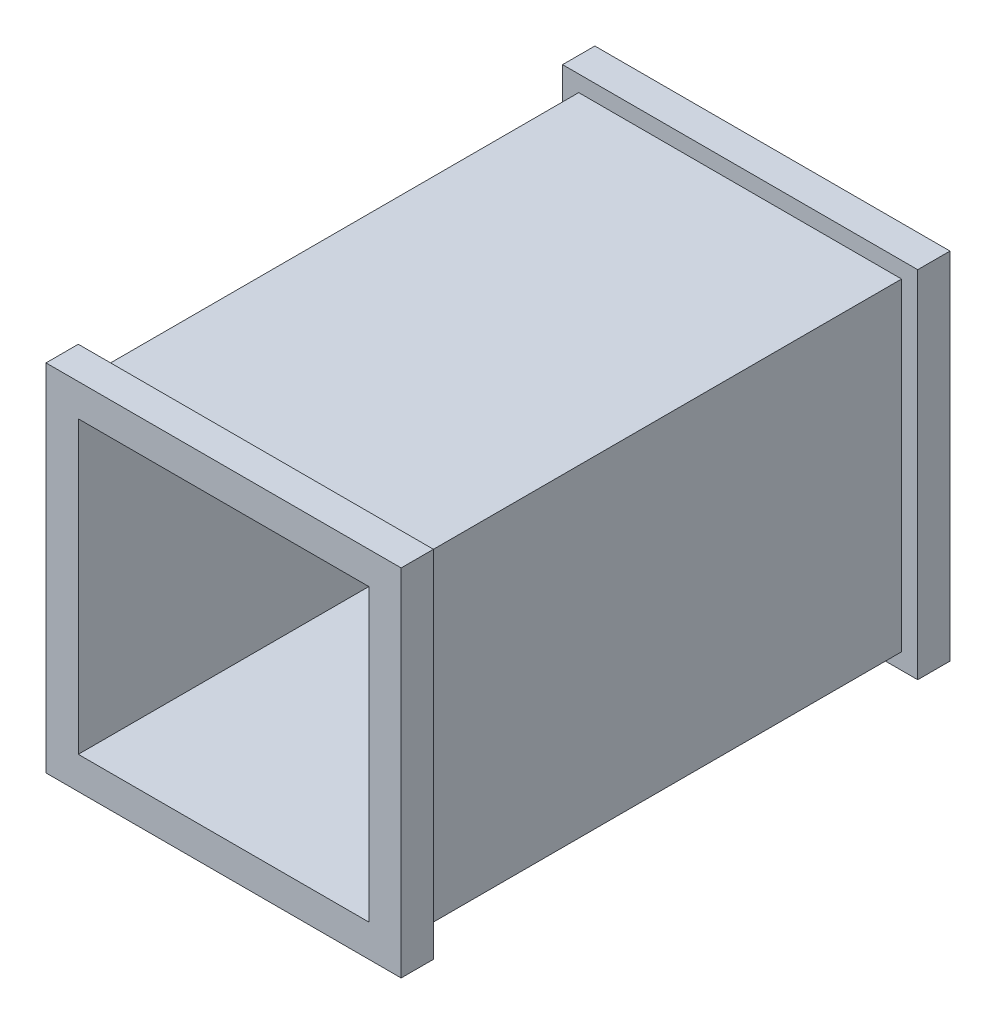
ISO-10303-21;
HEADER;
FILE_DESCRIPTION(('STEP AP214'),'2;1');
FILE_NAME('part.step','',(''),(''),'','','');
FILE_SCHEMA(('AUTOMOTIVE_DESIGN { 1 0 10303 214 1 1 1 1 }'));
ENDSEC;
DATA;
#1=APPLICATION_CONTEXT('core data for automotive mechanical design processes');
#2=APPLICATION_PROTOCOL_DEFINITION('international standard','automotive_design',2000,#1);
#3=PRODUCT_CONTEXT('',#1,'mechanical');
#4=PRODUCT('Part','Part','',(#3));
#5=PRODUCT_RELATED_PRODUCT_CATEGORY('part','',(#4));
#6=PRODUCT_DEFINITION_FORMATION('','',#4);
#7=PRODUCT_DEFINITION_CONTEXT('part definition',#1,'design');
#8=PRODUCT_DEFINITION('design','',#6,#7);
#9=PRODUCT_DEFINITION_SHAPE('','',#8);
#10=(LENGTH_UNIT() NAMED_UNIT(*) SI_UNIT(.MILLI.,.METRE.));
#11=(NAMED_UNIT(*) PLANE_ANGLE_UNIT() SI_UNIT($,.RADIAN.));
#12=(NAMED_UNIT(*) SI_UNIT($,.STERADIAN.) SOLID_ANGLE_UNIT());
#13=UNCERTAINTY_MEASURE_WITH_UNIT(LENGTH_MEASURE(1.E-05),#10,'distance_accuracy_value','');
#14=(GEOMETRIC_REPRESENTATION_CONTEXT(3) GLOBAL_UNCERTAINTY_ASSIGNED_CONTEXT((#13)) GLOBAL_UNIT_ASSIGNED_CONTEXT((#10,
#11,#12)) REPRESENTATION_CONTEXT('',''));
#15=CARTESIAN_POINT('',(0.,0.,0.));
#16=DIRECTION('',(0.,0.,1.));
#17=DIRECTION('',(1.,0.,0.));
#18=AXIS2_PLACEMENT_3D('',#15,#16,#17);
#19=CARTESIAN_POINT('',(127.,0.,0.));
#20=DIRECTION('',(1.,0.,0.));
#21=DIRECTION('',(0.,0.,-1.));
#22=AXIS2_PLACEMENT_3D('',#19,#20,#21);
#23=PLANE('',#22);
#24=DIRECTION('',(0.,0.,-1.));
#25=VECTOR('',#24,1.);
#26=CARTESIAN_POINT('',(127.,-127.,381.));
#27=LINE('',#26,#25);
#28=CARTESIAN_POINT('',(127.,-127.,381.));
#29=VERTEX_POINT('',#28);
#30=CARTESIAN_POINT('',(127.,-127.,0.));
#31=VERTEX_POINT('',#30);
#32=EDGE_CURVE('E328',#29,#31,#27,.T.);
#33=ORIENTED_EDGE('',*,*,#32,.T.);
#34=DIRECTION('',(0.,1.,0.));
#35=VECTOR('',#34,1.);
#36=CARTESIAN_POINT('',(127.,-127.,0.));
#37=LINE('',#36,#35);
#38=CARTESIAN_POINT('',(127.,127.,0.));
#39=VERTEX_POINT('',#38);
#40=EDGE_CURVE('E337',#31,#39,#37,.T.);
#41=ORIENTED_EDGE('',*,*,#40,.T.);
#42=DIRECTION('',(0.,0.,-1.));
#43=VECTOR('',#42,1.);
#44=CARTESIAN_POINT('',(127.,127.,381.));
#45=LINE('',#44,#43);
#46=CARTESIAN_POINT('',(127.,127.,381.));
#47=VERTEX_POINT('',#46);
#48=EDGE_CURVE('E325',#47,#39,#45,.T.);
#49=ORIENTED_EDGE('',*,*,#48,.F.);
#50=DIRECTION('',(0.,1.,0.));
#51=VECTOR('',#50,1.);
#52=CARTESIAN_POINT('',(127.,-127.,381.));
#53=LINE('',#52,#51);
#54=EDGE_CURVE('E185',#29,#47,#53,.T.);
#55=ORIENTED_EDGE('',*,*,#54,.F.);
#56=EDGE_LOOP('',(#33,#41,#49,#55));
#57=FACE_BOUND('',#56,.T.);
#58=ADVANCED_FACE('F57',(#57),#23,.T.);
#59=CARTESIAN_POINT('',(0.,127.,0.));
#60=DIRECTION('',(0.,1.,0.));
#61=DIRECTION('',(0.,0.,1.));
#62=AXIS2_PLACEMENT_3D('',#59,#60,#61);
#63=PLANE('',#62);
#64=ORIENTED_EDGE('',*,*,#48,.T.);
#65=DIRECTION('',(-1.,0.,0.));
#66=VECTOR('',#65,1.);
#67=CARTESIAN_POINT('',(-127.,127.,0.));
#68=LINE('',#67,#66);
#69=CARTESIAN_POINT('',(-127.,127.,0.));
#70=VERTEX_POINT('',#69);
#71=EDGE_CURVE('E345',#39,#70,#68,.T.);
#72=ORIENTED_EDGE('',*,*,#71,.T.);
#73=DIRECTION('',(0.,0.,-1.));
#74=VECTOR('',#73,1.);
#75=CARTESIAN_POINT('',(-127.,127.,381.));
#76=LINE('',#75,#74);
#77=CARTESIAN_POINT('',(-127.,127.,381.));
#78=VERTEX_POINT('',#77);
#79=EDGE_CURVE('E324',#78,#70,#76,.T.);
#80=ORIENTED_EDGE('',*,*,#79,.F.);
#81=DIRECTION('',(-1.,0.,0.));
#82=VECTOR('',#81,1.);
#83=CARTESIAN_POINT('',(-127.,127.,381.));
#84=LINE('',#83,#82);
#85=EDGE_CURVE('E368',#47,#78,#84,.T.);
#86=ORIENTED_EDGE('',*,*,#85,.F.);
#87=EDGE_LOOP('',(#64,#72,#80,#86));
#88=FACE_BOUND('',#87,.T.);
#89=ADVANCED_FACE('F384',(#88),#63,.T.);
#90=CARTESIAN_POINT('',(0.,-127.,0.));
#91=DIRECTION('',(0.,-1.,0.));
#92=DIRECTION('',(0.,0.,-1.));
#93=AXIS2_PLACEMENT_3D('',#90,#91,#92);
#94=PLANE('',#93);
#95=DIRECTION('',(0.,0.,-1.));
#96=VECTOR('',#95,1.);
#97=CARTESIAN_POINT('',(-127.,-127.,381.));
#98=LINE('',#97,#96);
#99=CARTESIAN_POINT('',(-127.,-127.,381.));
#100=VERTEX_POINT('',#99);
#101=CARTESIAN_POINT('',(-127.,-127.,0.));
#102=VERTEX_POINT('',#101);
#103=EDGE_CURVE('E320',#100,#102,#98,.T.);
#104=ORIENTED_EDGE('',*,*,#103,.T.);
#105=DIRECTION('',(1.,0.,0.));
#106=VECTOR('',#105,1.);
#107=CARTESIAN_POINT('',(-127.,-127.,0.));
#108=LINE('',#107,#106);
#109=EDGE_CURVE('E12',#102,#31,#108,.T.);
#110=ORIENTED_EDGE('',*,*,#109,.T.);
#111=ORIENTED_EDGE('',*,*,#32,.F.);
#112=DIRECTION('',(1.,0.,0.));
#113=VECTOR('',#112,1.);
#114=CARTESIAN_POINT('',(-127.,-127.,381.));
#115=LINE('',#114,#113);
#116=EDGE_CURVE('E332',#100,#29,#115,.T.);
#117=ORIENTED_EDGE('',*,*,#116,.F.);
#118=EDGE_LOOP('',(#104,#110,#111,#117));
#119=FACE_BOUND('',#118,.T.);
#120=ADVANCED_FACE('F386',(#119),#94,.T.);
#121=CARTESIAN_POINT('',(-127.,0.,0.));
#122=DIRECTION('',(-1.,0.,0.));
#123=DIRECTION('',(0.,0.,1.));
#124=AXIS2_PLACEMENT_3D('',#121,#122,#123);
#125=PLANE('',#124);
#126=ORIENTED_EDGE('',*,*,#79,.T.);
#127=DIRECTION('',(0.,-1.,0.));
#128=VECTOR('',#127,1.);
#129=CARTESIAN_POINT('',(-127.,-127.,0.));
#130=LINE('',#129,#128);
#131=EDGE_CURVE('E67',#70,#102,#130,.T.);
#132=ORIENTED_EDGE('',*,*,#131,.T.);
#133=ORIENTED_EDGE('',*,*,#103,.F.);
#134=DIRECTION('',(0.,-1.,0.));
#135=VECTOR('',#134,1.);
#136=CARTESIAN_POINT('',(-127.,-127.,381.));
#137=LINE('',#136,#135);
#138=EDGE_CURVE('E82',#78,#100,#137,.T.);
#139=ORIENTED_EDGE('',*,*,#138,.F.);
#140=EDGE_LOOP('',(#126,#132,#133,#139));
#141=FACE_BOUND('',#140,.T.);
#142=ADVANCED_FACE('F59',(#141),#125,.T.);
#143=CARTESIAN_POINT('',(-114.3,0.,0.));
#144=DIRECTION('',(1.,0.,0.));
#145=DIRECTION('',(0.,0.,-1.));
#146=AXIS2_PLACEMENT_3D('',#143,#144,#145);
#147=PLANE('',#146);
#148=DIRECTION('',(0.,0.,1.));
#149=VECTOR('',#148,1.);
#150=CARTESIAN_POINT('',(-114.3,-114.3,0.));
#151=LINE('',#150,#149);
#152=CARTESIAN_POINT('',(-114.3,-114.3,-25.4));
#153=VERTEX_POINT('',#152);
#154=CARTESIAN_POINT('',(-114.3,-114.3,406.4));
#155=VERTEX_POINT('',#154);
#156=EDGE_CURVE('E304',#153,#155,#151,.T.);
#157=ORIENTED_EDGE('',*,*,#156,.F.);
#158=DIRECTION('',(0.,1.,0.));
#159=VECTOR('',#158,1.);
#160=CARTESIAN_POINT('',(-114.3,-114.3,-25.4));
#161=LINE('',#160,#159);
#162=CARTESIAN_POINT('',(-114.3,114.3,-25.4));
#163=VERTEX_POINT('',#162);
#164=EDGE_CURVE('E249',#153,#163,#161,.T.);
#165=ORIENTED_EDGE('',*,*,#164,.T.);
#166=DIRECTION('',(0.,0.,1.));
#167=VECTOR('',#166,1.);
#168=CARTESIAN_POINT('',(-114.3,114.3,0.));
#169=LINE('',#168,#167);
#170=CARTESIAN_POINT('',(-114.3,114.3,406.4));
#171=VERTEX_POINT('',#170);
#172=EDGE_CURVE('E307',#163,#171,#169,.T.);
#173=ORIENTED_EDGE('',*,*,#172,.T.);
#174=DIRECTION('',(0.,-1.,0.));
#175=VECTOR('',#174,1.);
#176=CARTESIAN_POINT('',(-114.3,-114.3,406.4));
#177=LINE('',#176,#175);
#178=EDGE_CURVE('E198',#171,#155,#177,.T.);
#179=ORIENTED_EDGE('',*,*,#178,.T.);
#180=EDGE_LOOP('',(#157,#165,#173,#179));
#181=FACE_BOUND('',#180,.T.);
#182=ADVANCED_FACE('F414',(#181),#147,.T.);
#183=CARTESIAN_POINT('',(0.,114.3,0.));
#184=DIRECTION('',(0.,-1.,0.));
#185=DIRECTION('',(0.,0.,-1.));
#186=AXIS2_PLACEMENT_3D('',#183,#184,#185);
#187=PLANE('',#186);
#188=ORIENTED_EDGE('',*,*,#172,.F.);
#189=DIRECTION('',(1.,0.,0.));
#190=VECTOR('',#189,1.);
#191=CARTESIAN_POINT('',(114.3,114.3,-25.4));
#192=LINE('',#191,#190);
#193=CARTESIAN_POINT('',(114.3,114.3,-25.4));
#194=VERTEX_POINT('',#193);
#195=EDGE_CURVE('E180',#163,#194,#192,.T.);
#196=ORIENTED_EDGE('',*,*,#195,.T.);
#197=DIRECTION('',(0.,0.,1.));
#198=VECTOR('',#197,1.);
#199=CARTESIAN_POINT('',(114.3,114.3,0.));
#200=LINE('',#199,#198);
#201=CARTESIAN_POINT('',(114.3,114.3,406.4));
#202=VERTEX_POINT('',#201);
#203=EDGE_CURVE('E173',#194,#202,#200,.T.);
#204=ORIENTED_EDGE('',*,*,#203,.T.);
#205=DIRECTION('',(-1.,0.,0.));
#206=VECTOR('',#205,1.);
#207=CARTESIAN_POINT('',(-114.3,114.3,406.4));
#208=LINE('',#207,#206);
#209=EDGE_CURVE('E177',#202,#171,#208,.T.);
#210=ORIENTED_EDGE('',*,*,#209,.T.);
#211=EDGE_LOOP('',(#188,#196,#204,#210));
#212=FACE_BOUND('',#211,.T.);
#213=ADVANCED_FACE('F175',(#212),#187,.T.);
#214=CARTESIAN_POINT('',(0.,-114.3,0.));
#215=DIRECTION('',(0.,1.,0.));
#216=DIRECTION('',(0.,0.,1.));
#217=AXIS2_PLACEMENT_3D('',#214,#215,#216);
#218=PLANE('',#217);
#219=DIRECTION('',(0.,0.,1.));
#220=VECTOR('',#219,1.);
#221=CARTESIAN_POINT('',(114.3,-114.3,0.));
#222=LINE('',#221,#220);
#223=CARTESIAN_POINT('',(114.3,-114.3,-25.4));
#224=VERTEX_POINT('',#223);
#225=CARTESIAN_POINT('',(114.3,-114.3,406.4));
#226=VERTEX_POINT('',#225);
#227=EDGE_CURVE('E186',#224,#226,#222,.T.);
#228=ORIENTED_EDGE('',*,*,#227,.F.);
#229=DIRECTION('',(-1.,0.,0.));
#230=VECTOR('',#229,1.);
#231=CARTESIAN_POINT('',(114.3,-114.3,-25.4));
#232=LINE('',#231,#230);
#233=EDGE_CURVE('E258',#224,#153,#232,.T.);
#234=ORIENTED_EDGE('',*,*,#233,.T.);
#235=ORIENTED_EDGE('',*,*,#156,.T.);
#236=DIRECTION('',(1.,0.,0.));
#237=VECTOR('',#236,1.);
#238=CARTESIAN_POINT('',(-114.3,-114.3,406.4));
#239=LINE('',#238,#237);
#240=EDGE_CURVE('E202',#155,#226,#239,.T.);
#241=ORIENTED_EDGE('',*,*,#240,.T.);
#242=EDGE_LOOP('',(#228,#234,#235,#241));
#243=FACE_BOUND('',#242,.T.);
#244=ADVANCED_FACE('F399',(#243),#218,.T.);
#245=CARTESIAN_POINT('',(114.3,0.,0.));
#246=DIRECTION('',(-1.,0.,0.));
#247=DIRECTION('',(0.,0.,1.));
#248=AXIS2_PLACEMENT_3D('',#245,#246,#247);
#249=PLANE('',#248);
#250=ORIENTED_EDGE('',*,*,#203,.F.);
#251=DIRECTION('',(0.,-1.,0.));
#252=VECTOR('',#251,1.);
#253=CARTESIAN_POINT('',(114.3,-114.3,-25.4));
#254=LINE('',#253,#252);
#255=EDGE_CURVE('E255',#194,#224,#254,.T.);
#256=ORIENTED_EDGE('',*,*,#255,.T.);
#257=ORIENTED_EDGE('',*,*,#227,.T.);
#258=DIRECTION('',(0.,1.,0.));
#259=VECTOR('',#258,1.);
#260=CARTESIAN_POINT('',(114.3,-114.3,406.4));
#261=LINE('',#260,#259);
#262=EDGE_CURVE('E189',#226,#202,#261,.T.);
#263=ORIENTED_EDGE('',*,*,#262,.T.);
#264=EDGE_LOOP('',(#250,#256,#257,#263));
#265=FACE_BOUND('',#264,.T.);
#266=ADVANCED_FACE('F190',(#265),#249,.T.);
#267=CARTESIAN_POINT('',(0.,0.,0.));
#268=DIRECTION('',(0.,0.,-1.));
#269=DIRECTION('',(-1.,0.,0.));
#270=AXIS2_PLACEMENT_3D('',#267,#268,#269);
#271=PLANE('',#270);
#272=DIRECTION('',(-1.,0.,0.));
#273=VECTOR('',#272,1.);
#274=CARTESIAN_POINT('',(139.7,-139.7,0.));
#275=LINE('',#274,#273);
#276=CARTESIAN_POINT('',(139.7,-139.7,0.));
#277=VERTEX_POINT('',#276);
#278=CARTESIAN_POINT('',(-139.7,-139.7,0.));
#279=VERTEX_POINT('',#278);
#280=EDGE_CURVE('E262',#277,#279,#275,.T.);
#281=ORIENTED_EDGE('',*,*,#280,.F.);
#282=DIRECTION('',(0.,-1.,0.));
#283=VECTOR('',#282,1.);
#284=CARTESIAN_POINT('',(139.7,139.7,0.));
#285=LINE('',#284,#283);
#286=CARTESIAN_POINT('',(139.7,139.7,0.));
#287=VERTEX_POINT('',#286);
#288=EDGE_CURVE('E268',#287,#277,#285,.T.);
#289=ORIENTED_EDGE('',*,*,#288,.F.);
#290=DIRECTION('',(1.,0.,0.));
#291=VECTOR('',#290,1.);
#292=CARTESIAN_POINT('',(-139.7,139.7,0.));
#293=LINE('',#292,#291);
#294=CARTESIAN_POINT('',(-139.7,139.7,0.));
#295=VERTEX_POINT('',#294);
#296=EDGE_CURVE('E284',#295,#287,#293,.T.);
#297=ORIENTED_EDGE('',*,*,#296,.F.);
#298=DIRECTION('',(0.,1.,0.));
#299=VECTOR('',#298,1.);
#300=CARTESIAN_POINT('',(-139.7,-139.7,0.));
#301=LINE('',#300,#299);
#302=EDGE_CURVE('E281',#279,#295,#301,.T.);
#303=ORIENTED_EDGE('',*,*,#302,.F.);
#304=EDGE_LOOP('',(#281,#289,#297,#303));
#305=FACE_BOUND('',#304,.T.);
#306=ORIENTED_EDGE('',*,*,#71,.F.);
#307=ORIENTED_EDGE('',*,*,#40,.F.);
#308=ORIENTED_EDGE('',*,*,#109,.F.);
#309=ORIENTED_EDGE('',*,*,#131,.F.);
#310=EDGE_LOOP('',(#306,#307,#308,#309));
#311=FACE_BOUND('',#310,.T.);
#312=ADVANCED_FACE('F387',(#305,#311),#271,.F.);
#313=CARTESIAN_POINT('',(0.,0.,-25.4));
#314=DIRECTION('',(0.,0.,-1.));
#315=DIRECTION('',(-1.,0.,0.));
#316=AXIS2_PLACEMENT_3D('',#313,#314,#315);
#317=PLANE('',#316);
#318=DIRECTION('',(-1.,0.,0.));
#319=VECTOR('',#318,1.);
#320=CARTESIAN_POINT('',(139.7,-139.7,-25.4));
#321=LINE('',#320,#319);
#322=CARTESIAN_POINT('',(139.7,-139.7,-25.4));
#323=VERTEX_POINT('',#322);
#324=CARTESIAN_POINT('',(-139.7,-139.7,-25.4));
#325=VERTEX_POINT('',#324);
#326=EDGE_CURVE('E263',#323,#325,#321,.T.);
#327=ORIENTED_EDGE('',*,*,#326,.T.);
#328=DIRECTION('',(0.,1.,0.));
#329=VECTOR('',#328,1.);
#330=CARTESIAN_POINT('',(-139.7,-139.7,-25.4));
#331=LINE('',#330,#329);
#332=CARTESIAN_POINT('',(-139.7,139.7,-25.4));
#333=VERTEX_POINT('',#332);
#334=EDGE_CURVE('E267',#325,#333,#331,.T.);
#335=ORIENTED_EDGE('',*,*,#334,.T.);
#336=DIRECTION('',(1.,0.,0.));
#337=VECTOR('',#336,1.);
#338=CARTESIAN_POINT('',(-139.7,139.7,-25.4));
#339=LINE('',#338,#337);
#340=CARTESIAN_POINT('',(139.7,139.7,-25.4));
#341=VERTEX_POINT('',#340);
#342=EDGE_CURVE('E271',#333,#341,#339,.T.);
#343=ORIENTED_EDGE('',*,*,#342,.T.);
#344=DIRECTION('',(0.,-1.,0.));
#345=VECTOR('',#344,1.);
#346=CARTESIAN_POINT('',(139.7,139.7,-25.4));
#347=LINE('',#346,#345);
#348=EDGE_CURVE('E274',#341,#323,#347,.T.);
#349=ORIENTED_EDGE('',*,*,#348,.T.);
#350=EDGE_LOOP('',(#327,#335,#343,#349));
#351=FACE_BOUND('',#350,.T.);
#352=ORIENTED_EDGE('',*,*,#195,.F.);
#353=ORIENTED_EDGE('',*,*,#164,.F.);
#354=ORIENTED_EDGE('',*,*,#233,.F.);
#355=ORIENTED_EDGE('',*,*,#255,.F.);
#356=EDGE_LOOP('',(#352,#353,#354,#355));
#357=FACE_BOUND('',#356,.T.);
#358=ADVANCED_FACE('F389',(#351,#357),#317,.T.);
#359=CARTESIAN_POINT('',(139.7,-139.7,-25.4));
#360=DIRECTION('',(0.,1.,0.));
#361=DIRECTION('',(0.,0.,1.));
#362=AXIS2_PLACEMENT_3D('',#359,#360,#361);
#363=PLANE('',#362);
#364=ORIENTED_EDGE('',*,*,#280,.T.);
#365=DIRECTION('',(0.,0.,1.));
#366=VECTOR('',#365,1.);
#367=CARTESIAN_POINT('',(-139.7,-139.7,-25.4));
#368=LINE('',#367,#366);
#369=EDGE_CURVE('E300',#325,#279,#368,.T.);
#370=ORIENTED_EDGE('',*,*,#369,.F.);
#371=ORIENTED_EDGE('',*,*,#326,.F.);
#372=DIRECTION('',(0.,0.,1.));
#373=VECTOR('',#372,1.);
#374=CARTESIAN_POINT('',(139.7,-139.7,-25.4));
#375=LINE('',#374,#373);
#376=EDGE_CURVE('E277',#323,#277,#375,.T.);
#377=ORIENTED_EDGE('',*,*,#376,.T.);
#378=EDGE_LOOP('',(#364,#370,#371,#377));
#379=FACE_BOUND('',#378,.T.);
#380=ADVANCED_FACE('F396',(#379),#363,.F.);
#381=CARTESIAN_POINT('',(-139.7,-139.7,-25.4));
#382=DIRECTION('',(1.,0.,0.));
#383=DIRECTION('',(0.,0.,-1.));
#384=AXIS2_PLACEMENT_3D('',#381,#382,#383);
#385=PLANE('',#384);
#386=ORIENTED_EDGE('',*,*,#302,.T.);
#387=DIRECTION('',(0.,0.,1.));
#388=VECTOR('',#387,1.);
#389=CARTESIAN_POINT('',(-139.7,139.7,-25.4));
#390=LINE('',#389,#388);
#391=EDGE_CURVE('E296',#333,#295,#390,.T.);
#392=ORIENTED_EDGE('',*,*,#391,.F.);
#393=ORIENTED_EDGE('',*,*,#334,.F.);
#394=ORIENTED_EDGE('',*,*,#369,.T.);
#395=EDGE_LOOP('',(#386,#392,#393,#394));
#396=FACE_BOUND('',#395,.T.);
#397=ADVANCED_FACE('F524',(#396),#385,.F.);
#398=CARTESIAN_POINT('',(-139.7,139.7,-25.4));
#399=DIRECTION('',(0.,-1.,0.));
#400=DIRECTION('',(0.,0.,-1.));
#401=AXIS2_PLACEMENT_3D('',#398,#399,#400);
#402=PLANE('',#401);
#403=ORIENTED_EDGE('',*,*,#296,.T.);
#404=DIRECTION('',(0.,0.,1.));
#405=VECTOR('',#404,1.);
#406=CARTESIAN_POINT('',(139.7,139.7,-25.4));
#407=LINE('',#406,#405);
#408=EDGE_CURVE('E292',#341,#287,#407,.T.);
#409=ORIENTED_EDGE('',*,*,#408,.F.);
#410=ORIENTED_EDGE('',*,*,#342,.F.);
#411=ORIENTED_EDGE('',*,*,#391,.T.);
#412=EDGE_LOOP('',(#403,#409,#410,#411));
#413=FACE_BOUND('',#412,.T.);
#414=ADVANCED_FACE('F517',(#413),#402,.F.);
#415=CARTESIAN_POINT('',(139.7,139.7,-25.4));
#416=DIRECTION('',(-1.,0.,0.));
#417=DIRECTION('',(0.,0.,1.));
#418=AXIS2_PLACEMENT_3D('',#415,#416,#417);
#419=PLANE('',#418);
#420=ORIENTED_EDGE('',*,*,#288,.T.);
#421=ORIENTED_EDGE('',*,*,#376,.F.);
#422=ORIENTED_EDGE('',*,*,#348,.F.);
#423=ORIENTED_EDGE('',*,*,#408,.T.);
#424=EDGE_LOOP('',(#420,#421,#422,#423));
#425=FACE_BOUND('',#424,.T.);
#426=ADVANCED_FACE('F449',(#425),#419,.F.);
#427=CARTESIAN_POINT('',(0.,0.,381.));
#428=DIRECTION('',(0.,0.,1.));
#429=DIRECTION('',(1.,0.,0.));
#430=AXIS2_PLACEMENT_3D('',#427,#428,#429);
#431=PLANE('',#430);
#432=DIRECTION('',(1.,0.,0.));
#433=VECTOR('',#432,1.);
#434=CARTESIAN_POINT('',(-139.7,-139.7,381.));
#435=LINE('',#434,#433);
#436=CARTESIAN_POINT('',(-139.7,-139.7,381.));
#437=VERTEX_POINT('',#436);
#438=CARTESIAN_POINT('',(139.7,-139.7,381.));
#439=VERTEX_POINT('',#438);
#440=EDGE_CURVE('E207',#437,#439,#435,.T.);
#441=ORIENTED_EDGE('',*,*,#440,.F.);
#442=DIRECTION('',(0.,-1.,0.));
#443=VECTOR('',#442,1.);
#444=CARTESIAN_POINT('',(-139.7,139.7,381.));
#445=LINE('',#444,#443);
#446=CARTESIAN_POINT('',(-139.7,139.7,381.));
#447=VERTEX_POINT('',#446);
#448=EDGE_CURVE('E213',#447,#437,#445,.T.);
#449=ORIENTED_EDGE('',*,*,#448,.F.);
#450=DIRECTION('',(-1.,0.,0.));
#451=VECTOR('',#450,1.);
#452=CARTESIAN_POINT('',(139.7,139.7,381.));
#453=LINE('',#452,#451);
#454=CARTESIAN_POINT('',(139.7,139.7,381.));
#455=VERTEX_POINT('',#454);
#456=EDGE_CURVE('E229',#455,#447,#453,.T.);
#457=ORIENTED_EDGE('',*,*,#456,.F.);
#458=DIRECTION('',(0.,1.,0.));
#459=VECTOR('',#458,1.);
#460=CARTESIAN_POINT('',(139.7,-139.7,381.));
#461=LINE('',#460,#459);
#462=EDGE_CURVE('E226',#439,#455,#461,.T.);
#463=ORIENTED_EDGE('',*,*,#462,.F.);
#464=EDGE_LOOP('',(#441,#449,#457,#463));
#465=FACE_BOUND('',#464,.T.);
#466=ORIENTED_EDGE('',*,*,#116,.T.);
#467=ORIENTED_EDGE('',*,*,#54,.T.);
#468=ORIENTED_EDGE('',*,*,#85,.T.);
#469=ORIENTED_EDGE('',*,*,#138,.T.);
#470=EDGE_LOOP('',(#466,#467,#468,#469));
#471=FACE_BOUND('',#470,.T.);
#472=ADVANCED_FACE('F379',(#465,#471),#431,.F.);
#473=CARTESIAN_POINT('',(0.,0.,406.4));
#474=DIRECTION('',(0.,0.,1.));
#475=DIRECTION('',(1.,0.,0.));
#476=AXIS2_PLACEMENT_3D('',#473,#474,#475);
#477=PLANE('',#476);
#478=DIRECTION('',(1.,0.,0.));
#479=VECTOR('',#478,1.);
#480=CARTESIAN_POINT('',(-139.7,-139.7,406.4));
#481=LINE('',#480,#479);
#482=CARTESIAN_POINT('',(-139.7,-139.7,406.4));
#483=VERTEX_POINT('',#482);
#484=CARTESIAN_POINT('',(139.7,-139.7,406.4));
#485=VERTEX_POINT('',#484);
#486=EDGE_CURVE('E208',#483,#485,#481,.T.);
#487=ORIENTED_EDGE('',*,*,#486,.T.);
#488=DIRECTION('',(0.,1.,0.));
#489=VECTOR('',#488,1.);
#490=CARTESIAN_POINT('',(139.7,-139.7,406.4));
#491=LINE('',#490,#489);
#492=CARTESIAN_POINT('',(139.7,139.7,406.4));
#493=VERTEX_POINT('',#492);
#494=EDGE_CURVE('E212',#485,#493,#491,.T.);
#495=ORIENTED_EDGE('',*,*,#494,.T.);
#496=DIRECTION('',(-1.,0.,0.));
#497=VECTOR('',#496,1.);
#498=CARTESIAN_POINT('',(139.7,139.7,406.4));
#499=LINE('',#498,#497);
#500=CARTESIAN_POINT('',(-139.7,139.7,406.4));
#501=VERTEX_POINT('',#500);
#502=EDGE_CURVE('E216',#493,#501,#499,.T.);
#503=ORIENTED_EDGE('',*,*,#502,.T.);
#504=DIRECTION('',(0.,-1.,0.));
#505=VECTOR('',#504,1.);
#506=CARTESIAN_POINT('',(-139.7,139.7,406.4));
#507=LINE('',#506,#505);
#508=EDGE_CURVE('E219',#501,#483,#507,.T.);
#509=ORIENTED_EDGE('',*,*,#508,.T.);
#510=EDGE_LOOP('',(#487,#495,#503,#509));
#511=FACE_BOUND('',#510,.T.);
#512=ORIENTED_EDGE('',*,*,#209,.F.);
#513=ORIENTED_EDGE('',*,*,#262,.F.);
#514=ORIENTED_EDGE('',*,*,#240,.F.);
#515=ORIENTED_EDGE('',*,*,#178,.F.);
#516=EDGE_LOOP('',(#512,#513,#514,#515));
#517=FACE_BOUND('',#516,.T.);
#518=ADVANCED_FACE('F196',(#511,#517),#477,.T.);
#519=CARTESIAN_POINT('',(-139.7,-139.7,406.4));
#520=DIRECTION('',(0.,1.,0.));
#521=DIRECTION('',(0.,0.,1.));
#522=AXIS2_PLACEMENT_3D('',#519,#520,#521);
#523=PLANE('',#522);
#524=ORIENTED_EDGE('',*,*,#440,.T.);
#525=DIRECTION('',(0.,0.,-1.));
#526=VECTOR('',#525,1.);
#527=CARTESIAN_POINT('',(139.7,-139.7,406.4));
#528=LINE('',#527,#526);
#529=EDGE_CURVE('E245',#485,#439,#528,.T.);
#530=ORIENTED_EDGE('',*,*,#529,.F.);
#531=ORIENTED_EDGE('',*,*,#486,.F.);
#532=DIRECTION('',(0.,0.,-1.));
#533=VECTOR('',#532,1.);
#534=CARTESIAN_POINT('',(-139.7,-139.7,406.4));
#535=LINE('',#534,#533);
#536=EDGE_CURVE('E222',#483,#437,#535,.T.);
#537=ORIENTED_EDGE('',*,*,#536,.T.);
#538=EDGE_LOOP('',(#524,#530,#531,#537));
#539=FACE_BOUND('',#538,.T.);
#540=ADVANCED_FACE('F460',(#539),#523,.F.);
#541=CARTESIAN_POINT('',(139.7,-139.7,406.4));
#542=DIRECTION('',(-1.,0.,0.));
#543=DIRECTION('',(0.,0.,1.));
#544=AXIS2_PLACEMENT_3D('',#541,#542,#543);
#545=PLANE('',#544);
#546=ORIENTED_EDGE('',*,*,#462,.T.);
#547=DIRECTION('',(0.,0.,-1.));
#548=VECTOR('',#547,1.);
#549=CARTESIAN_POINT('',(139.7,139.7,406.4));
#550=LINE('',#549,#548);
#551=EDGE_CURVE('E241',#493,#455,#550,.T.);
#552=ORIENTED_EDGE('',*,*,#551,.F.);
#553=ORIENTED_EDGE('',*,*,#494,.F.);
#554=ORIENTED_EDGE('',*,*,#529,.T.);
#555=EDGE_LOOP('',(#546,#552,#553,#554));
#556=FACE_BOUND('',#555,.T.);
#557=ADVANCED_FACE('F470',(#556),#545,.F.);
#558=CARTESIAN_POINT('',(139.7,139.7,406.4));
#559=DIRECTION('',(0.,-1.,0.));
#560=DIRECTION('',(0.,0.,-1.));
#561=AXIS2_PLACEMENT_3D('',#558,#559,#560);
#562=PLANE('',#561);
#563=ORIENTED_EDGE('',*,*,#456,.T.);
#564=DIRECTION('',(0.,0.,-1.));
#565=VECTOR('',#564,1.);
#566=CARTESIAN_POINT('',(-139.7,139.7,406.4));
#567=LINE('',#566,#565);
#568=EDGE_CURVE('E237',#501,#447,#567,.T.);
#569=ORIENTED_EDGE('',*,*,#568,.F.);
#570=ORIENTED_EDGE('',*,*,#502,.F.);
#571=ORIENTED_EDGE('',*,*,#551,.T.);
#572=EDGE_LOOP('',(#563,#569,#570,#571));
#573=FACE_BOUND('',#572,.T.);
#574=ADVANCED_FACE('F480',(#573),#562,.F.);
#575=CARTESIAN_POINT('',(-139.7,139.7,406.4));
#576=DIRECTION('',(1.,0.,0.));
#577=DIRECTION('',(0.,1.,0.));
#578=AXIS2_PLACEMENT_3D('',#575,#576,#577);
#579=PLANE('',#578);
#580=ORIENTED_EDGE('',*,*,#448,.T.);
#581=ORIENTED_EDGE('',*,*,#536,.F.);
#582=ORIENTED_EDGE('',*,*,#508,.F.);
#583=ORIENTED_EDGE('',*,*,#568,.T.);
#584=EDGE_LOOP('',(#580,#581,#582,#583));
#585=FACE_BOUND('',#584,.T.);
#586=ADVANCED_FACE('F490',(#585),#579,.F.);
#587=CLOSED_SHELL('',(#58,#89,#120,#142,#182,#213,#244,#266,#312,#358,#380,#397,#414,#426,#472,
#518,#540,#557,#574,#586));
#588=MANIFOLD_SOLID_BREP('B2',#587);
#589=ADVANCED_BREP_SHAPE_REPRESENTATION('',(#18,#588),#14);
#590=SHAPE_DEFINITION_REPRESENTATION(#9,#589);
ENDSEC;
END-ISO-10303-21;
